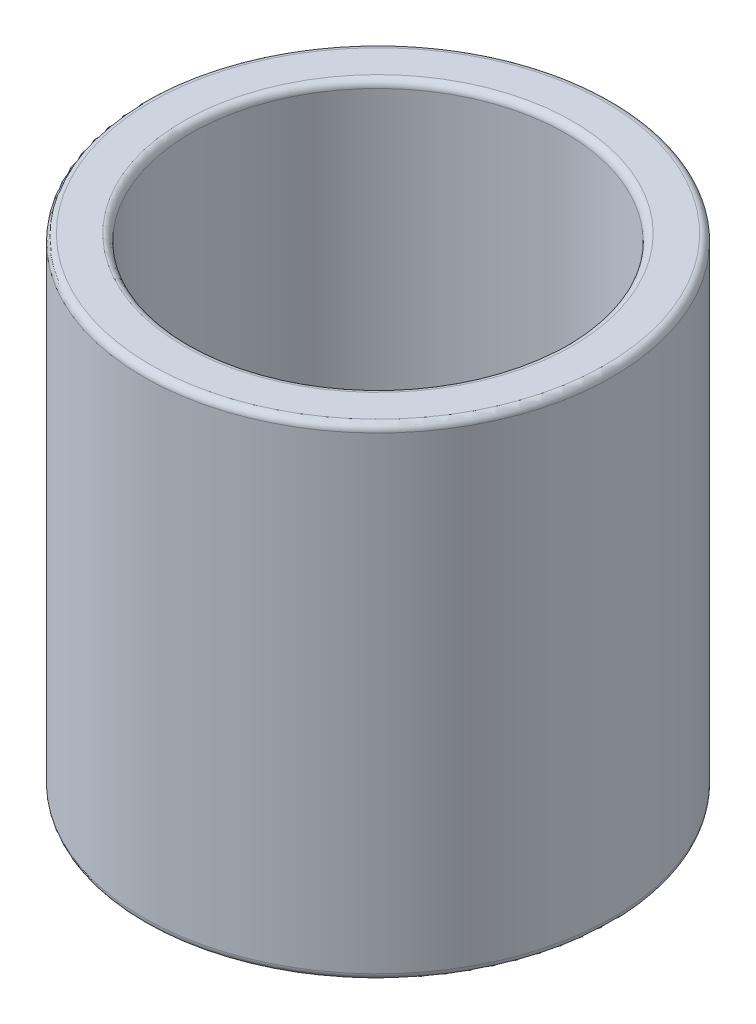
ISO-10303-21;
HEADER;
FILE_DESCRIPTION(('STEP AP214'),'2;1');
FILE_NAME('part.step','',(''),(''),'','','');
FILE_SCHEMA(('AUTOMOTIVE_DESIGN { 1 0 10303 214 1 1 1 1 }'));
ENDSEC;
DATA;
#1=APPLICATION_CONTEXT('core data for automotive mechanical design processes');
#2=APPLICATION_PROTOCOL_DEFINITION('international standard','automotive_design',2000,#1);
#3=PRODUCT_CONTEXT('',#1,'mechanical');
#4=PRODUCT('Part','Part','',(#3));
#5=PRODUCT_RELATED_PRODUCT_CATEGORY('part','',(#4));
#6=PRODUCT_DEFINITION_FORMATION('','',#4);
#7=PRODUCT_DEFINITION_CONTEXT('part definition',#1,'design');
#8=PRODUCT_DEFINITION('design','',#6,#7);
#9=PRODUCT_DEFINITION_SHAPE('','',#8);
#10=(LENGTH_UNIT() NAMED_UNIT(*) SI_UNIT(.MILLI.,.METRE.));
#11=(NAMED_UNIT(*) PLANE_ANGLE_UNIT() SI_UNIT($,.RADIAN.));
#12=(NAMED_UNIT(*) SI_UNIT($,.STERADIAN.) SOLID_ANGLE_UNIT());
#13=UNCERTAINTY_MEASURE_WITH_UNIT(LENGTH_MEASURE(1.E-05),#10,'distance_accuracy_value','');
#14=(GEOMETRIC_REPRESENTATION_CONTEXT(3) GLOBAL_UNCERTAINTY_ASSIGNED_CONTEXT((#13)) GLOBAL_UNIT_ASSIGNED_CONTEXT((#10,
#11,#12)) REPRESENTATION_CONTEXT('',''));
#15=CARTESIAN_POINT('',(0.,0.,0.));
#16=DIRECTION('',(0.,0.,1.));
#17=DIRECTION('',(1.,0.,0.));
#18=AXIS2_PLACEMENT_3D('',#15,#16,#17);
#19=CARTESIAN_POINT('',(0.,10.287,0.));
#20=DIRECTION('',(0.,1.,0.));
#21=DIRECTION('',(0.,0.,1.));
#22=AXIS2_PLACEMENT_3D('',#19,#20,#21);
#23=PLANE('',#22);
#24=CARTESIAN_POINT('',(0.,10.287,0.));
#25=DIRECTION('',(0.,1.,0.));
#26=DIRECTION('',(0.,0.,1.));
#27=AXIS2_PLACEMENT_3D('',#24,#25,#26);
#28=CIRCLE('',#27,4.15);
#29=CARTESIAN_POINT('',(0.,10.287,4.15));
#30=VERTEX_POINT('',#29);
#31=EDGE_CURVE('E54',#30,#30,#28,.F.);
#32=ORIENTED_EDGE('',*,*,#31,.T.);
#33=EDGE_LOOP('',(#32));
#34=FACE_BOUND('',#33,.T.);
#35=CARTESIAN_POINT('',(0.,10.287,0.));
#36=DIRECTION('',(0.,1.,0.));
#37=DIRECTION('',(0.,0.,1.));
#38=AXIS2_PLACEMENT_3D('',#35,#36,#37);
#39=CIRCLE('',#38,4.85);
#40=CARTESIAN_POINT('',(0.,10.287,4.85));
#41=VERTEX_POINT('',#40);
#42=EDGE_CURVE('E57',#41,#41,#39,.T.);
#43=ORIENTED_EDGE('',*,*,#42,.T.);
#44=EDGE_LOOP('',(#43));
#45=FACE_BOUND('',#44,.T.);
#46=ADVANCED_FACE('F34',(#34,#45),#23,.T.);
#47=CARTESIAN_POINT('',(0.,0.,0.));
#48=DIRECTION('',(0.,1.,0.));
#49=DIRECTION('',(0.,0.,1.));
#50=AXIS2_PLACEMENT_3D('',#47,#48,#49);
#51=PLANE('',#50);
#52=CARTESIAN_POINT('',(0.,0.,0.));
#53=DIRECTION('',(0.,1.,0.));
#54=DIRECTION('',(0.,0.,1.));
#55=AXIS2_PLACEMENT_3D('',#52,#53,#54);
#56=CIRCLE('',#55,4.15);
#57=CARTESIAN_POINT('',(0.,0.,4.15));
#58=VERTEX_POINT('',#57);
#59=EDGE_CURVE('E10',#58,#58,#56,.T.);
#60=ORIENTED_EDGE('',*,*,#59,.T.);
#61=EDGE_LOOP('',(#60));
#62=FACE_BOUND('',#61,.T.);
#63=CARTESIAN_POINT('',(0.,0.,0.));
#64=DIRECTION('',(0.,1.,0.));
#65=DIRECTION('',(0.,0.,1.));
#66=AXIS2_PLACEMENT_3D('',#63,#64,#65);
#67=CIRCLE('',#66,4.85);
#68=CARTESIAN_POINT('',(0.,0.,4.85));
#69=VERTEX_POINT('',#68);
#70=EDGE_CURVE('E41',#69,#69,#67,.F.);
#71=ORIENTED_EDGE('',*,*,#70,.T.);
#72=EDGE_LOOP('',(#71));
#73=FACE_BOUND('',#72,.T.);
#74=ADVANCED_FACE('F82',(#62,#73),#51,.F.);
#75=CARTESIAN_POINT('',(0.,10.287,0.));
#76=DIRECTION('',(0.,-1.,0.));
#77=DIRECTION('',(0.,0.,-1.));
#78=AXIS2_PLACEMENT_3D('',#75,#76,#77);
#79=CYLINDRICAL_SURFACE('',#78,5.);
#80=CARTESIAN_POINT('',(0.,10.137,0.));
#81=DIRECTION('',(0.,1.,0.));
#82=DIRECTION('',(0.,0.,1.));
#83=AXIS2_PLACEMENT_3D('',#80,#81,#82);
#84=CIRCLE('',#83,5.);
#85=CARTESIAN_POINT('',(0.,10.137,5.));
#86=VERTEX_POINT('',#85);
#87=EDGE_CURVE('E45',#86,#86,#84,.F.);
#88=ORIENTED_EDGE('',*,*,#87,.T.);
#89=EDGE_LOOP('',(#88));
#90=FACE_BOUND('',#89,.T.);
#91=CARTESIAN_POINT('',(0.,0.150000000000001,0.));
#92=DIRECTION('',(0.,1.,0.));
#93=DIRECTION('',(0.,0.,1.));
#94=AXIS2_PLACEMENT_3D('',#91,#92,#93);
#95=CIRCLE('',#94,5.);
#96=CARTESIAN_POINT('',(0.,0.150000000000001,5.));
#97=VERTEX_POINT('',#96);
#98=EDGE_CURVE('E49',#97,#97,#95,.T.);
#99=ORIENTED_EDGE('',*,*,#98,.T.);
#100=EDGE_LOOP('',(#99));
#101=FACE_BOUND('',#100,.T.);
#102=ADVANCED_FACE('F88',(#90,#101),#79,.T.);
#103=CARTESIAN_POINT('',(0.,10.287,0.));
#104=DIRECTION('',(0.,-1.,0.));
#105=DIRECTION('',(0.,0.,-1.));
#106=AXIS2_PLACEMENT_3D('',#103,#104,#105);
#107=CYLINDRICAL_SURFACE('',#106,4.);
#108=CARTESIAN_POINT('',(0.,10.137,0.));
#109=DIRECTION('',(0.,1.,0.));
#110=DIRECTION('',(0.,0.,1.));
#111=AXIS2_PLACEMENT_3D('',#108,#109,#110);
#112=CIRCLE('',#111,4.);
#113=CARTESIAN_POINT('',(0.,10.137,4.));
#114=VERTEX_POINT('',#113);
#115=EDGE_CURVE('E60',#114,#114,#112,.T.);
#116=ORIENTED_EDGE('',*,*,#115,.T.);
#117=EDGE_LOOP('',(#116));
#118=FACE_BOUND('',#117,.T.);
#119=CARTESIAN_POINT('',(0.,0.150000000000001,0.));
#120=DIRECTION('',(0.,1.,0.));
#121=DIRECTION('',(0.,0.,1.));
#122=AXIS2_PLACEMENT_3D('',#119,#120,#121);
#123=CIRCLE('',#122,4.);
#124=CARTESIAN_POINT('',(0.,0.150000000000001,4.));
#125=VERTEX_POINT('',#124);
#126=EDGE_CURVE('E63',#125,#125,#123,.F.);
#127=ORIENTED_EDGE('',*,*,#126,.T.);
#128=EDGE_LOOP('',(#127));
#129=FACE_BOUND('',#128,.T.);
#130=ADVANCED_FACE('F67',(#118,#129),#107,.F.);
#131=CARTESIAN_POINT('',(0.,10.137,0.));
#132=DIRECTION('',(0.,1.,0.));
#133=DIRECTION('',(0.,0.,1.));
#134=AXIS2_PLACEMENT_3D('',#131,#132,#133);
#135=TOROIDAL_SURFACE('',#134,4.15,0.15);
#136=ORIENTED_EDGE('',*,*,#31,.F.);
#137=EDGE_LOOP('',(#136));
#138=FACE_BOUND('',#137,.T.);
#139=ORIENTED_EDGE('',*,*,#115,.F.);
#140=EDGE_LOOP('',(#139));
#141=FACE_BOUND('',#140,.T.);
#142=ADVANCED_FACE('F78',(#138,#141),#135,.T.);
#143=CARTESIAN_POINT('',(0.,10.137,0.));
#144=DIRECTION('',(0.,1.,0.));
#145=DIRECTION('',(0.,0.,1.));
#146=AXIS2_PLACEMENT_3D('',#143,#144,#145);
#147=TOROIDAL_SURFACE('',#146,4.85,0.15);
#148=ORIENTED_EDGE('',*,*,#87,.F.);
#149=EDGE_LOOP('',(#148));
#150=FACE_BOUND('',#149,.T.);
#151=ORIENTED_EDGE('',*,*,#42,.F.);
#152=EDGE_LOOP('',(#151));
#153=FACE_BOUND('',#152,.T.);
#154=ADVANCED_FACE('F72',(#150,#153),#147,.T.);
#155=CARTESIAN_POINT('',(0.,0.150000000000001,0.));
#156=DIRECTION('',(0.,1.,0.));
#157=DIRECTION('',(0.,0.,1.));
#158=AXIS2_PLACEMENT_3D('',#155,#156,#157);
#159=TOROIDAL_SURFACE('',#158,4.15,0.15);
#160=ORIENTED_EDGE('',*,*,#126,.F.);
#161=EDGE_LOOP('',(#160));
#162=FACE_BOUND('',#161,.T.);
#163=ORIENTED_EDGE('',*,*,#59,.F.);
#164=EDGE_LOOP('',(#163));
#165=FACE_BOUND('',#164,.T.);
#166=ADVANCED_FACE('F69',(#162,#165),#159,.T.);
#167=CARTESIAN_POINT('',(0.,0.150000000000001,0.));
#168=DIRECTION('',(0.,1.,0.));
#169=DIRECTION('',(0.,0.,1.));
#170=AXIS2_PLACEMENT_3D('',#167,#168,#169);
#171=TOROIDAL_SURFACE('',#170,4.85,0.15);
#172=ORIENTED_EDGE('',*,*,#70,.F.);
#173=EDGE_LOOP('',(#172));
#174=FACE_BOUND('',#173,.T.);
#175=ORIENTED_EDGE('',*,*,#98,.F.);
#176=EDGE_LOOP('',(#175));
#177=FACE_BOUND('',#176,.T.);
#178=ADVANCED_FACE('F36',(#174,#177),#171,.T.);
#179=CLOSED_SHELL('',(#46,#74,#102,#130,#142,#154,#166,#178));
#180=MANIFOLD_SOLID_BREP('B2',#179);
#181=ADVANCED_BREP_SHAPE_REPRESENTATION('',(#18,#180),#14);
#182=SHAPE_DEFINITION_REPRESENTATION(#9,#181);
ENDSEC;
END-ISO-10303-21;
